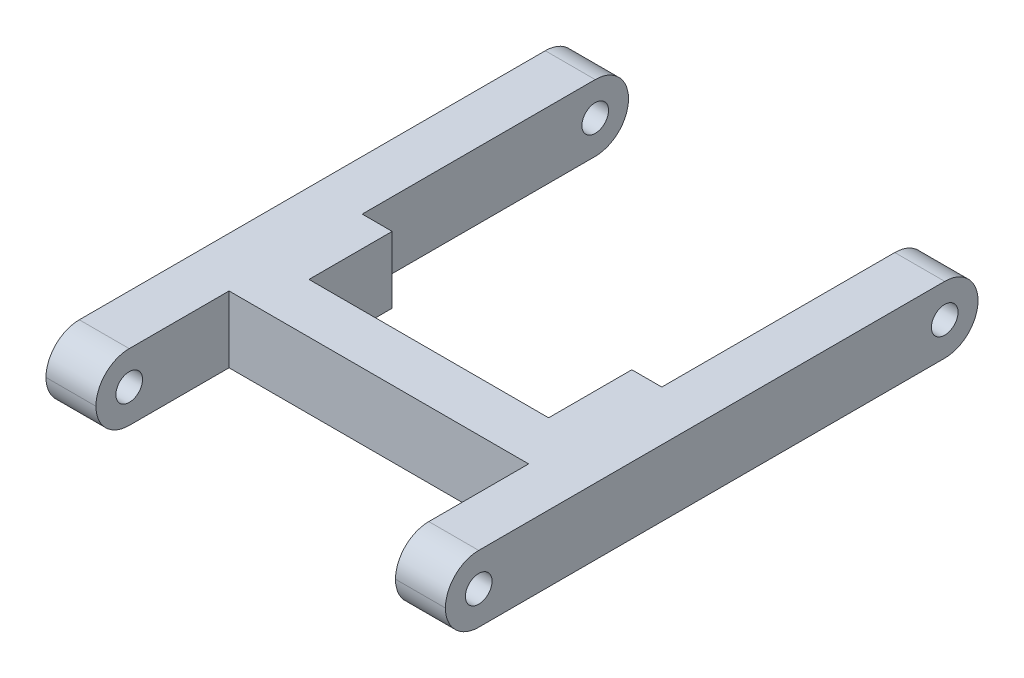
ISO-10303-21;
HEADER;
FILE_DESCRIPTION(('STEP AP214'),'2;1');
FILE_NAME('part.step','',(''),(''),'','','');
FILE_SCHEMA(('AUTOMOTIVE_DESIGN { 1 0 10303 214 1 1 1 1 }'));
ENDSEC;
DATA;
#1=APPLICATION_CONTEXT('core data for automotive mechanical design processes');
#2=APPLICATION_PROTOCOL_DEFINITION('international standard','automotive_design',2000,#1);
#3=PRODUCT_CONTEXT('',#1,'mechanical');
#4=PRODUCT('Part','Part','',(#3));
#5=PRODUCT_RELATED_PRODUCT_CATEGORY('part','',(#4));
#6=PRODUCT_DEFINITION_FORMATION('','',#4);
#7=PRODUCT_DEFINITION_CONTEXT('part definition',#1,'design');
#8=PRODUCT_DEFINITION('design','',#6,#7);
#9=PRODUCT_DEFINITION_SHAPE('','',#8);
#10=(LENGTH_UNIT() NAMED_UNIT(*) SI_UNIT(.MILLI.,.METRE.));
#11=(NAMED_UNIT(*) PLANE_ANGLE_UNIT() SI_UNIT($,.RADIAN.));
#12=(NAMED_UNIT(*) SI_UNIT($,.STERADIAN.) SOLID_ANGLE_UNIT());
#13=UNCERTAINTY_MEASURE_WITH_UNIT(LENGTH_MEASURE(1.E-05),#10,'distance_accuracy_value','');
#14=(GEOMETRIC_REPRESENTATION_CONTEXT(3) GLOBAL_UNCERTAINTY_ASSIGNED_CONTEXT((#13)) GLOBAL_UNIT_ASSIGNED_CONTEXT((#10,
#11,#12)) REPRESENTATION_CONTEXT('',''));
#15=CARTESIAN_POINT('',(0.,0.,0.));
#16=DIRECTION('',(0.,0.,1.));
#17=DIRECTION('',(1.,0.,0.));
#18=AXIS2_PLACEMENT_3D('',#15,#16,#17);
#19=CARTESIAN_POINT('',(0.,10.,0.));
#20=DIRECTION('',(0.,1.,0.));
#21=DIRECTION('',(0.,0.,1.));
#22=AXIS2_PLACEMENT_3D('',#19,#20,#21);
#23=PLANE('',#22);
#24=DIRECTION('',(1.,0.,0.));
#25=VECTOR('',#24,1.);
#26=CARTESIAN_POINT('',(-22.5,10.,0.));
#27=LINE('',#26,#25);
#28=CARTESIAN_POINT('',(18.,10.,0.));
#29=VERTEX_POINT('',#28);
#30=CARTESIAN_POINT('',(22.5,10.,0.));
#31=VERTEX_POINT('',#30);
#32=EDGE_CURVE('E274',#29,#31,#27,.T.);
#33=ORIENTED_EDGE('',*,*,#32,.F.);
#34=DIRECTION('',(0.,0.,1.));
#35=VECTOR('',#34,1.);
#36=CARTESIAN_POINT('',(18.,10.,0.));
#37=LINE('',#36,#35);
#38=CARTESIAN_POINT('',(18.,10.,12.5));
#39=VERTEX_POINT('',#38);
#40=EDGE_CURVE('E226',#29,#39,#37,.T.);
#41=ORIENTED_EDGE('',*,*,#40,.T.);
#42=DIRECTION('',(1.,0.,0.));
#43=VECTOR('',#42,1.);
#44=CARTESIAN_POINT('',(0.,10.,12.5));
#45=LINE('',#44,#43);
#46=CARTESIAN_POINT('',(-18.,10.,12.5));
#47=VERTEX_POINT('',#46);
#48=EDGE_CURVE('E223',#47,#39,#45,.T.);
#49=ORIENTED_EDGE('',*,*,#48,.F.);
#50=DIRECTION('',(0.,0.,1.));
#51=VECTOR('',#50,1.);
#52=CARTESIAN_POINT('',(-18.,10.,0.));
#53=LINE('',#52,#51);
#54=CARTESIAN_POINT('',(-18.,10.,0.));
#55=VERTEX_POINT('',#54);
#56=EDGE_CURVE('E204',#55,#47,#53,.T.);
#57=ORIENTED_EDGE('',*,*,#56,.F.);
#58=CARTESIAN_POINT('',(-22.5,10.,0.));
#59=VERTEX_POINT('',#58);
#60=EDGE_CURVE('E283',#59,#55,#27,.T.);
#61=ORIENTED_EDGE('',*,*,#60,.F.);
#62=DIRECTION('',(0.,0.,1.));
#63=VECTOR('',#62,1.);
#64=CARTESIAN_POINT('',(-22.5,10.,-40.));
#65=LINE('',#64,#63);
#66=CARTESIAN_POINT('',(-22.5,10.,-35.));
#67=VERTEX_POINT('',#66);
#68=EDGE_CURVE('E289',#67,#59,#65,.T.);
#69=ORIENTED_EDGE('',*,*,#68,.F.);
#70=DIRECTION('',(1.,0.,0.));
#71=VECTOR('',#70,1.);
#72=CARTESIAN_POINT('',(0.,10.,-35.));
#73=LINE('',#72,#71);
#74=CARTESIAN_POINT('',(-30.,10.,-35.));
#75=VERTEX_POINT('',#74);
#76=EDGE_CURVE('E361',#67,#75,#73,.F.);
#77=ORIENTED_EDGE('',*,*,#76,.T.);
#78=DIRECTION('',(0.,0.,-1.));
#79=VECTOR('',#78,1.);
#80=CARTESIAN_POINT('',(-30.,10.,40.));
#81=LINE('',#80,#79);
#82=CARTESIAN_POINT('',(-30.,10.,35.));
#83=VERTEX_POINT('',#82);
#84=EDGE_CURVE('E300',#83,#75,#81,.T.);
#85=ORIENTED_EDGE('',*,*,#84,.F.);
#86=DIRECTION('',(1.,0.,0.));
#87=VECTOR('',#86,1.);
#88=CARTESIAN_POINT('',(-22.5,10.,35.));
#89=LINE('',#88,#87);
#90=CARTESIAN_POINT('',(-22.5,10.,35.));
#91=VERTEX_POINT('',#90);
#92=EDGE_CURVE('E359',#83,#91,#89,.T.);
#93=ORIENTED_EDGE('',*,*,#92,.T.);
#94=DIRECTION('',(0.,0.,-1.));
#95=VECTOR('',#94,1.);
#96=CARTESIAN_POINT('',(-22.5,10.,40.));
#97=LINE('',#96,#95);
#98=CARTESIAN_POINT('',(-22.5,10.,20.));
#99=VERTEX_POINT('',#98);
#100=EDGE_CURVE('E259',#91,#99,#97,.T.);
#101=ORIENTED_EDGE('',*,*,#100,.T.);
#102=DIRECTION('',(1.,0.,0.));
#103=VECTOR('',#102,1.);
#104=CARTESIAN_POINT('',(-22.5,10.,20.));
#105=LINE('',#104,#103);
#106=CARTESIAN_POINT('',(22.5,10.,20.));
#107=VERTEX_POINT('',#106);
#108=EDGE_CURVE('E254',#99,#107,#105,.T.);
#109=ORIENTED_EDGE('',*,*,#108,.T.);
#110=DIRECTION('',(0.,0.,-1.));
#111=VECTOR('',#110,1.);
#112=CARTESIAN_POINT('',(22.5,10.,40.));
#113=LINE('',#112,#111);
#114=CARTESIAN_POINT('',(22.5,10.,35.));
#115=VERTEX_POINT('',#114);
#116=EDGE_CURVE('E266',#115,#107,#113,.T.);
#117=ORIENTED_EDGE('',*,*,#116,.F.);
#118=DIRECTION('',(1.,0.,0.));
#119=VECTOR('',#118,1.);
#120=CARTESIAN_POINT('',(30.,10.,35.));
#121=LINE('',#120,#119);
#122=CARTESIAN_POINT('',(30.,10.,35.));
#123=VERTEX_POINT('',#122);
#124=EDGE_CURVE('E357',#115,#123,#121,.T.);
#125=ORIENTED_EDGE('',*,*,#124,.T.);
#126=DIRECTION('',(0.,0.,-1.));
#127=VECTOR('',#126,1.);
#128=CARTESIAN_POINT('',(30.,10.,40.));
#129=LINE('',#128,#127);
#130=CARTESIAN_POINT('',(30.,10.,-35.));
#131=VERTEX_POINT('',#130);
#132=EDGE_CURVE('E297',#123,#131,#129,.T.);
#133=ORIENTED_EDGE('',*,*,#132,.T.);
#134=DIRECTION('',(1.,0.,0.));
#135=VECTOR('',#134,1.);
#136=CARTESIAN_POINT('',(0.,10.,-35.));
#137=LINE('',#136,#135);
#138=CARTESIAN_POINT('',(22.5,10.,-35.));
#139=VERTEX_POINT('',#138);
#140=EDGE_CURVE('E355',#131,#139,#137,.F.);
#141=ORIENTED_EDGE('',*,*,#140,.T.);
#142=DIRECTION('',(0.,0.,1.));
#143=VECTOR('',#142,1.);
#144=CARTESIAN_POINT('',(22.5,10.,-40.));
#145=LINE('',#144,#143);
#146=EDGE_CURVE('E286',#139,#31,#145,.T.);
#147=ORIENTED_EDGE('',*,*,#146,.T.);
#148=EDGE_LOOP('',(#33,#41,#49,#57,#61,#69,#77,#85,#93,#101,#109,#117,#125,#133,#141,#147));
#149=FACE_BOUND('',#148,.T.);
#150=ADVANCED_FACE('F65',(#149),#23,.T.);
#151=CARTESIAN_POINT('',(0.,0.,0.));
#152=DIRECTION('',(0.,1.,0.));
#153=DIRECTION('',(0.,0.,1.));
#154=AXIS2_PLACEMENT_3D('',#151,#152,#153);
#155=PLANE('',#154);
#156=DIRECTION('',(0.,0.,1.));
#157=VECTOR('',#156,1.);
#158=CARTESIAN_POINT('',(18.,0.,0.));
#159=LINE('',#158,#157);
#160=CARTESIAN_POINT('',(18.,0.,0.));
#161=VERTEX_POINT('',#160);
#162=CARTESIAN_POINT('',(18.,0.,12.5));
#163=VERTEX_POINT('',#162);
#164=EDGE_CURVE('E221',#161,#163,#159,.T.);
#165=ORIENTED_EDGE('',*,*,#164,.F.);
#166=DIRECTION('',(1.,0.,0.));
#167=VECTOR('',#166,1.);
#168=CARTESIAN_POINT('',(-22.5,0.,0.));
#169=LINE('',#168,#167);
#170=CARTESIAN_POINT('',(22.5,0.,0.));
#171=VERTEX_POINT('',#170);
#172=EDGE_CURVE('E277',#161,#171,#169,.T.);
#173=ORIENTED_EDGE('',*,*,#172,.T.);
#174=DIRECTION('',(0.,0.,1.));
#175=VECTOR('',#174,1.);
#176=CARTESIAN_POINT('',(22.5,0.,-40.));
#177=LINE('',#176,#175);
#178=CARTESIAN_POINT('',(22.5,0.,-35.));
#179=VERTEX_POINT('',#178);
#180=EDGE_CURVE('E276',#179,#171,#177,.T.);
#181=ORIENTED_EDGE('',*,*,#180,.F.);
#182=DIRECTION('',(1.,0.,0.));
#183=VECTOR('',#182,1.);
#184=CARTESIAN_POINT('',(30.,0.,-35.));
#185=LINE('',#184,#183);
#186=CARTESIAN_POINT('',(30.,0.,-35.));
#187=VERTEX_POINT('',#186);
#188=EDGE_CURVE('E320',#179,#187,#185,.T.);
#189=ORIENTED_EDGE('',*,*,#188,.T.);
#190=DIRECTION('',(0.,0.,-1.));
#191=VECTOR('',#190,1.);
#192=CARTESIAN_POINT('',(30.,0.,40.));
#193=LINE('',#192,#191);
#194=CARTESIAN_POINT('',(30.,0.,35.));
#195=VERTEX_POINT('',#194);
#196=EDGE_CURVE('E294',#195,#187,#193,.T.);
#197=ORIENTED_EDGE('',*,*,#196,.F.);
#198=DIRECTION('',(1.,0.,0.));
#199=VECTOR('',#198,1.);
#200=CARTESIAN_POINT('',(0.,0.,35.));
#201=LINE('',#200,#199);
#202=CARTESIAN_POINT('',(22.5,0.,35.));
#203=VERTEX_POINT('',#202);
#204=EDGE_CURVE('E329',#195,#203,#201,.F.);
#205=ORIENTED_EDGE('',*,*,#204,.T.);
#206=DIRECTION('',(0.,0.,-1.));
#207=VECTOR('',#206,1.);
#208=CARTESIAN_POINT('',(22.5,0.,40.));
#209=LINE('',#208,#207);
#210=CARTESIAN_POINT('',(22.5,0.,20.));
#211=VERTEX_POINT('',#210);
#212=EDGE_CURVE('E258',#203,#211,#209,.T.);
#213=ORIENTED_EDGE('',*,*,#212,.T.);
#214=DIRECTION('',(1.,0.,0.));
#215=VECTOR('',#214,1.);
#216=CARTESIAN_POINT('',(-22.5,0.,20.));
#217=LINE('',#216,#215);
#218=CARTESIAN_POINT('',(-22.5,0.,20.));
#219=VERTEX_POINT('',#218);
#220=EDGE_CURVE('E255',#219,#211,#217,.T.);
#221=ORIENTED_EDGE('',*,*,#220,.F.);
#222=DIRECTION('',(0.,0.,-1.));
#223=VECTOR('',#222,1.);
#224=CARTESIAN_POINT('',(-22.5,0.,40.));
#225=LINE('',#224,#223);
#226=CARTESIAN_POINT('',(-22.5,0.,35.));
#227=VERTEX_POINT('',#226);
#228=EDGE_CURVE('E261',#227,#219,#225,.T.);
#229=ORIENTED_EDGE('',*,*,#228,.F.);
#230=DIRECTION('',(1.,0.,0.));
#231=VECTOR('',#230,1.);
#232=CARTESIAN_POINT('',(0.,0.,35.));
#233=LINE('',#232,#231);
#234=CARTESIAN_POINT('',(-30.,0.,35.));
#235=VERTEX_POINT('',#234);
#236=EDGE_CURVE('E326',#227,#235,#233,.F.);
#237=ORIENTED_EDGE('',*,*,#236,.T.);
#238=DIRECTION('',(0.,0.,-1.));
#239=VECTOR('',#238,1.);
#240=CARTESIAN_POINT('',(-30.,0.,40.));
#241=LINE('',#240,#239);
#242=CARTESIAN_POINT('',(-30.,0.,-35.));
#243=VERTEX_POINT('',#242);
#244=EDGE_CURVE('E301',#235,#243,#241,.T.);
#245=ORIENTED_EDGE('',*,*,#244,.T.);
#246=DIRECTION('',(1.,0.,0.));
#247=VECTOR('',#246,1.);
#248=CARTESIAN_POINT('',(-22.5,0.,-35.));
#249=LINE('',#248,#247);
#250=CARTESIAN_POINT('',(-22.5,0.,-35.));
#251=VERTEX_POINT('',#250);
#252=EDGE_CURVE('E323',#243,#251,#249,.T.);
#253=ORIENTED_EDGE('',*,*,#252,.T.);
#254=DIRECTION('',(0.,0.,1.));
#255=VECTOR('',#254,1.);
#256=CARTESIAN_POINT('',(-22.5,0.,-40.));
#257=LINE('',#256,#255);
#258=CARTESIAN_POINT('',(-22.5,0.,0.));
#259=VERTEX_POINT('',#258);
#260=EDGE_CURVE('E280',#251,#259,#257,.T.);
#261=ORIENTED_EDGE('',*,*,#260,.T.);
#262=CARTESIAN_POINT('',(-18.,0.,0.));
#263=VERTEX_POINT('',#262);
#264=EDGE_CURVE('E220',#259,#263,#169,.T.);
#265=ORIENTED_EDGE('',*,*,#264,.T.);
#266=DIRECTION('',(0.,0.,1.));
#267=VECTOR('',#266,1.);
#268=CARTESIAN_POINT('',(-18.,0.,0.));
#269=LINE('',#268,#267);
#270=CARTESIAN_POINT('',(-18.,0.,12.5));
#271=VERTEX_POINT('',#270);
#272=EDGE_CURVE('E80',#263,#271,#269,.T.);
#273=ORIENTED_EDGE('',*,*,#272,.T.);
#274=DIRECTION('',(1.,0.,0.));
#275=VECTOR('',#274,1.);
#276=CARTESIAN_POINT('',(0.,0.,12.5));
#277=LINE('',#276,#275);
#278=EDGE_CURVE('E209',#271,#163,#277,.T.);
#279=ORIENTED_EDGE('',*,*,#278,.T.);
#280=EDGE_LOOP('',(#165,#173,#181,#189,#197,#205,#213,#221,#229,#237,#245,#253,#261,#265,#273,#279));
#281=FACE_BOUND('',#280,.T.);
#282=ADVANCED_FACE('F218',(#281),#155,.F.);
#283=CARTESIAN_POINT('',(-22.5,0.,0.));
#284=DIRECTION('',(0.,0.,1.));
#285=DIRECTION('',(1.,0.,0.));
#286=AXIS2_PLACEMENT_3D('',#283,#284,#285);
#287=PLANE('',#286);
#288=DIRECTION('',(0.,-1.,0.));
#289=VECTOR('',#288,1.);
#290=CARTESIAN_POINT('',(18.,0.,0.));
#291=LINE('',#290,#289);
#292=EDGE_CURVE('E12',#29,#161,#291,.T.);
#293=ORIENTED_EDGE('',*,*,#292,.F.);
#294=ORIENTED_EDGE('',*,*,#32,.T.);
#295=DIRECTION('',(0.,1.,0.));
#296=VECTOR('',#295,1.);
#297=CARTESIAN_POINT('',(22.5,0.,0.));
#298=LINE('',#297,#296);
#299=EDGE_CURVE('E282',#171,#31,#298,.T.);
#300=ORIENTED_EDGE('',*,*,#299,.F.);
#301=ORIENTED_EDGE('',*,*,#172,.F.);
#302=EDGE_LOOP('',(#293,#294,#300,#301));
#303=FACE_BOUND('',#302,.T.);
#304=ADVANCED_FACE('F383',(#303),#287,.F.);
#305=CARTESIAN_POINT('',(-30.,10.,40.));
#306=DIRECTION('',(-1.,0.,0.));
#307=DIRECTION('',(0.,0.,1.));
#308=AXIS2_PLACEMENT_3D('',#305,#306,#307);
#309=PLANE('',#308);
#310=CARTESIAN_POINT('',(-30.,5.,-35.));
#311=DIRECTION('',(-1.,0.,0.));
#312=DIRECTION('',(0.,0.,1.));
#313=AXIS2_PLACEMENT_3D('',#310,#311,#312);
#314=CIRCLE('',#313,5.);
#315=CARTESIAN_POINT('',(-30.,5.,-40.));
#316=VERTEX_POINT('',#315);
#317=EDGE_CURVE('E344',#75,#316,#314,.T.);
#318=ORIENTED_EDGE('',*,*,#317,.T.);
#319=CARTESIAN_POINT('',(-30.,5.,-35.));
#320=DIRECTION('',(-1.,0.,0.));
#321=DIRECTION('',(0.,0.,1.));
#322=AXIS2_PLACEMENT_3D('',#319,#320,#321);
#323=CIRCLE('',#322,5.);
#324=EDGE_CURVE('E346',#316,#243,#323,.T.);
#325=ORIENTED_EDGE('',*,*,#324,.T.);
#326=ORIENTED_EDGE('',*,*,#244,.F.);
#327=CARTESIAN_POINT('',(-30.,5.,35.));
#328=DIRECTION('',(-1.,0.,0.));
#329=DIRECTION('',(0.,0.,1.));
#330=AXIS2_PLACEMENT_3D('',#327,#328,#329);
#331=CIRCLE('',#330,5.);
#332=CARTESIAN_POINT('',(-30.,5.,40.));
#333=VERTEX_POINT('',#332);
#334=EDGE_CURVE('E342',#235,#333,#331,.T.);
#335=ORIENTED_EDGE('',*,*,#334,.T.);
#336=CARTESIAN_POINT('',(-30.,5.,35.));
#337=DIRECTION('',(-1.,0.,0.));
#338=DIRECTION('',(0.,0.,1.));
#339=AXIS2_PLACEMENT_3D('',#336,#337,#338);
#340=CIRCLE('',#339,5.);
#341=EDGE_CURVE('E340',#333,#83,#340,.T.);
#342=ORIENTED_EDGE('',*,*,#341,.T.);
#343=ORIENTED_EDGE('',*,*,#84,.T.);
#344=EDGE_LOOP('',(#318,#325,#326,#335,#342,#343));
#345=FACE_BOUND('',#344,.T.);
#346=CARTESIAN_POINT('',(-30.,5.,-35.));
#347=DIRECTION('',(-1.,0.,0.));
#348=DIRECTION('',(0.,0.,1.));
#349=AXIS2_PLACEMENT_3D('',#346,#347,#348);
#350=CIRCLE('',#349,2.00000000000012);
#351=CARTESIAN_POINT('',(-30.,5.,-32.9999999999999));
#352=VERTEX_POINT('',#351);
#353=EDGE_CURVE('E240',#352,#352,#350,.T.);
#354=ORIENTED_EDGE('',*,*,#353,.F.);
#355=EDGE_LOOP('',(#354));
#356=FACE_BOUND('',#355,.T.);
#357=CARTESIAN_POINT('',(-30.,4.99999999999995,34.9999999999999));
#358=DIRECTION('',(-1.,0.,0.));
#359=DIRECTION('',(0.,0.,1.));
#360=AXIS2_PLACEMENT_3D('',#357,#358,#359);
#361=CIRCLE('',#360,1.99999999999999);
#362=CARTESIAN_POINT('',(-30.,4.99999999999995,36.9999999999999));
#363=VERTEX_POINT('',#362);
#364=EDGE_CURVE('E237',#363,#363,#361,.F.);
#365=ORIENTED_EDGE('',*,*,#364,.T.);
#366=EDGE_LOOP('',(#365));
#367=FACE_BOUND('',#366,.T.);
#368=ADVANCED_FACE('F430',(#345,#356,#367),#309,.T.);
#369=CARTESIAN_POINT('',(30.,10.,40.));
#370=DIRECTION('',(-1.,0.,0.));
#371=DIRECTION('',(0.,0.,1.));
#372=AXIS2_PLACEMENT_3D('',#369,#370,#371);
#373=PLANE('',#372);
#374=CARTESIAN_POINT('',(30.,5.,-35.));
#375=DIRECTION('',(-1.,0.,0.));
#376=DIRECTION('',(0.,0.,1.));
#377=AXIS2_PLACEMENT_3D('',#374,#375,#376);
#378=CIRCLE('',#377,2.00000000000012);
#379=CARTESIAN_POINT('',(30.,5.,-32.9999999999999));
#380=VERTEX_POINT('',#379);
#381=EDGE_CURVE('E243',#380,#380,#378,.T.);
#382=ORIENTED_EDGE('',*,*,#381,.T.);
#383=EDGE_LOOP('',(#382));
#384=FACE_BOUND('',#383,.T.);
#385=CARTESIAN_POINT('',(30.,5.,35.));
#386=DIRECTION('',(-1.,0.,0.));
#387=DIRECTION('',(0.,0.,1.));
#388=AXIS2_PLACEMENT_3D('',#385,#386,#387);
#389=CIRCLE('',#388,5.);
#390=CARTESIAN_POINT('',(30.,5.,40.));
#391=VERTEX_POINT('',#390);
#392=EDGE_CURVE('E316',#123,#391,#389,.F.);
#393=ORIENTED_EDGE('',*,*,#392,.T.);
#394=CARTESIAN_POINT('',(30.,5.,35.));
#395=DIRECTION('',(-1.,0.,0.));
#396=DIRECTION('',(0.,0.,1.));
#397=AXIS2_PLACEMENT_3D('',#394,#395,#396);
#398=CIRCLE('',#397,5.);
#399=EDGE_CURVE('E318',#391,#195,#398,.F.);
#400=ORIENTED_EDGE('',*,*,#399,.T.);
#401=ORIENTED_EDGE('',*,*,#196,.T.);
#402=CARTESIAN_POINT('',(30.,5.,-35.));
#403=DIRECTION('',(-1.,0.,0.));
#404=DIRECTION('',(0.,0.,1.));
#405=AXIS2_PLACEMENT_3D('',#402,#403,#404);
#406=CIRCLE('',#405,5.);
#407=CARTESIAN_POINT('',(30.,5.,-40.));
#408=VERTEX_POINT('',#407);
#409=EDGE_CURVE('E314',#187,#408,#406,.F.);
#410=ORIENTED_EDGE('',*,*,#409,.T.);
#411=CARTESIAN_POINT('',(30.,5.,-35.));
#412=DIRECTION('',(-1.,0.,0.));
#413=DIRECTION('',(0.,0.,1.));
#414=AXIS2_PLACEMENT_3D('',#411,#412,#413);
#415=CIRCLE('',#414,5.);
#416=EDGE_CURVE('E304',#408,#131,#415,.F.);
#417=ORIENTED_EDGE('',*,*,#416,.T.);
#418=ORIENTED_EDGE('',*,*,#132,.F.);
#419=EDGE_LOOP('',(#393,#400,#401,#410,#417,#418));
#420=FACE_BOUND('',#419,.T.);
#421=CARTESIAN_POINT('',(30.,4.99999999999995,34.9999999999999));
#422=DIRECTION('',(-1.,0.,0.));
#423=DIRECTION('',(0.,0.,1.));
#424=AXIS2_PLACEMENT_3D('',#421,#422,#423);
#425=CIRCLE('',#424,1.99999999999999);
#426=CARTESIAN_POINT('',(30.,4.99999999999995,36.9999999999999));
#427=VERTEX_POINT('',#426);
#428=EDGE_CURVE('E233',#427,#427,#425,.F.);
#429=ORIENTED_EDGE('',*,*,#428,.F.);
#430=EDGE_LOOP('',(#429));
#431=FACE_BOUND('',#430,.T.);
#432=ADVANCED_FACE('F394',(#384,#420,#431),#373,.F.);
#433=ORIENTED_EDGE('',*,*,#60,.T.);
#434=DIRECTION('',(0.,-1.,0.));
#435=VECTOR('',#434,1.);
#436=CARTESIAN_POINT('',(-18.,0.,0.));
#437=LINE('',#436,#435);
#438=EDGE_CURVE('E73',#55,#263,#437,.T.);
#439=ORIENTED_EDGE('',*,*,#438,.T.);
#440=ORIENTED_EDGE('',*,*,#264,.F.);
#441=DIRECTION('',(0.,1.,0.));
#442=VECTOR('',#441,1.);
#443=CARTESIAN_POINT('',(-22.5,0.,0.));
#444=LINE('',#443,#442);
#445=EDGE_CURVE('E291',#259,#59,#444,.T.);
#446=ORIENTED_EDGE('',*,*,#445,.T.);
#447=EDGE_LOOP('',(#433,#439,#440,#446));
#448=FACE_BOUND('',#447,.T.);
#449=ADVANCED_FACE('F373',(#448),#287,.F.);
#450=CARTESIAN_POINT('',(-22.5,0.,-40.));
#451=DIRECTION('',(-1.,0.,0.));
#452=DIRECTION('',(0.,0.,1.));
#453=AXIS2_PLACEMENT_3D('',#450,#451,#452);
#454=PLANE('',#453);
#455=CARTESIAN_POINT('',(-22.5,5.,-35.));
#456=DIRECTION('',(-1.,0.,0.));
#457=DIRECTION('',(0.,0.,1.));
#458=AXIS2_PLACEMENT_3D('',#455,#456,#457);
#459=CIRCLE('',#458,2.00000000000012);
#460=CARTESIAN_POINT('',(-22.5,5.,-32.9999999999999));
#461=VERTEX_POINT('',#460);
#462=EDGE_CURVE('E251',#461,#461,#459,.T.);
#463=ORIENTED_EDGE('',*,*,#462,.T.);
#464=EDGE_LOOP('',(#463));
#465=FACE_BOUND('',#464,.T.);
#466=ORIENTED_EDGE('',*,*,#260,.F.);
#467=CARTESIAN_POINT('',(-22.5,5.,-35.));
#468=DIRECTION('',(-1.,0.,0.));
#469=DIRECTION('',(0.,0.,1.));
#470=AXIS2_PLACEMENT_3D('',#467,#468,#469);
#471=CIRCLE('',#470,5.);
#472=CARTESIAN_POINT('',(-22.5,5.,-40.));
#473=VERTEX_POINT('',#472);
#474=EDGE_CURVE('E350',#251,#473,#471,.F.);
#475=ORIENTED_EDGE('',*,*,#474,.T.);
#476=CARTESIAN_POINT('',(-22.5,5.,-35.));
#477=DIRECTION('',(-1.,0.,0.));
#478=DIRECTION('',(0.,0.,1.));
#479=AXIS2_PLACEMENT_3D('',#476,#477,#478);
#480=CIRCLE('',#479,5.);
#481=EDGE_CURVE('E348',#473,#67,#480,.F.);
#482=ORIENTED_EDGE('',*,*,#481,.T.);
#483=ORIENTED_EDGE('',*,*,#68,.T.);
#484=ORIENTED_EDGE('',*,*,#445,.F.);
#485=EDGE_LOOP('',(#466,#475,#482,#483,#484));
#486=FACE_BOUND('',#485,.T.);
#487=ADVANCED_FACE('F490',(#465,#486),#454,.F.);
#488=CARTESIAN_POINT('',(22.5,0.,-40.));
#489=DIRECTION('',(-1.,0.,0.));
#490=DIRECTION('',(0.,0.,1.));
#491=AXIS2_PLACEMENT_3D('',#488,#489,#490);
#492=PLANE('',#491);
#493=CARTESIAN_POINT('',(22.5,5.,-35.));
#494=DIRECTION('',(-1.,0.,0.));
#495=DIRECTION('',(0.,0.,1.));
#496=AXIS2_PLACEMENT_3D('',#493,#494,#495);
#497=CIRCLE('',#496,2.00000000000012);
#498=CARTESIAN_POINT('',(22.5,5.,-32.9999999999999));
#499=VERTEX_POINT('',#498);
#500=EDGE_CURVE('E250',#499,#499,#497,.T.);
#501=ORIENTED_EDGE('',*,*,#500,.F.);
#502=EDGE_LOOP('',(#501));
#503=FACE_BOUND('',#502,.T.);
#504=CARTESIAN_POINT('',(22.5,5.,-35.));
#505=DIRECTION('',(-1.,0.,0.));
#506=DIRECTION('',(0.,0.,1.));
#507=AXIS2_PLACEMENT_3D('',#504,#505,#506);
#508=CIRCLE('',#507,5.);
#509=CARTESIAN_POINT('',(22.5,5.,-40.));
#510=VERTEX_POINT('',#509);
#511=EDGE_CURVE('E88',#139,#510,#508,.T.);
#512=ORIENTED_EDGE('',*,*,#511,.T.);
#513=CARTESIAN_POINT('',(22.5,5.,-35.));
#514=DIRECTION('',(-1.,0.,0.));
#515=DIRECTION('',(0.,0.,1.));
#516=AXIS2_PLACEMENT_3D('',#513,#514,#515);
#517=CIRCLE('',#516,5.);
#518=EDGE_CURVE('E353',#510,#179,#517,.T.);
#519=ORIENTED_EDGE('',*,*,#518,.T.);
#520=ORIENTED_EDGE('',*,*,#180,.T.);
#521=ORIENTED_EDGE('',*,*,#299,.T.);
#522=ORIENTED_EDGE('',*,*,#146,.F.);
#523=EDGE_LOOP('',(#512,#519,#520,#521,#522));
#524=FACE_BOUND('',#523,.T.);
#525=ADVANCED_FACE('F387',(#503,#524),#492,.T.);
#526=CARTESIAN_POINT('',(-22.5,0.,20.));
#527=DIRECTION('',(0.,0.,1.));
#528=DIRECTION('',(1.,0.,0.));
#529=AXIS2_PLACEMENT_3D('',#526,#527,#528);
#530=PLANE('',#529);
#531=ORIENTED_EDGE('',*,*,#108,.F.);
#532=DIRECTION('',(0.,1.,0.));
#533=VECTOR('',#532,1.);
#534=CARTESIAN_POINT('',(-22.5,0.,20.));
#535=LINE('',#534,#533);
#536=EDGE_CURVE('E263',#219,#99,#535,.T.);
#537=ORIENTED_EDGE('',*,*,#536,.F.);
#538=ORIENTED_EDGE('',*,*,#220,.T.);
#539=DIRECTION('',(0.,1.,0.));
#540=VECTOR('',#539,1.);
#541=CARTESIAN_POINT('',(22.5,0.,20.));
#542=LINE('',#541,#540);
#543=EDGE_CURVE('E271',#211,#107,#542,.T.);
#544=ORIENTED_EDGE('',*,*,#543,.T.);
#545=EDGE_LOOP('',(#531,#537,#538,#544));
#546=FACE_BOUND('',#545,.T.);
#547=ADVANCED_FACE('F412',(#546),#530,.T.);
#548=CARTESIAN_POINT('',(22.5,0.,40.));
#549=DIRECTION('',(1.,0.,0.));
#550=DIRECTION('',(0.,0.,-1.));
#551=AXIS2_PLACEMENT_3D('',#548,#549,#550);
#552=PLANE('',#551);
#553=CARTESIAN_POINT('',(22.5,4.99999999999995,34.9999999999999));
#554=DIRECTION('',(1.,0.,0.));
#555=DIRECTION('',(0.,0.,-1.));
#556=AXIS2_PLACEMENT_3D('',#553,#554,#555);
#557=CIRCLE('',#556,1.99999999999999);
#558=CARTESIAN_POINT('',(22.5,4.99999999999995,32.9999999999999));
#559=VERTEX_POINT('',#558);
#560=EDGE_CURVE('E247',#559,#559,#557,.F.);
#561=ORIENTED_EDGE('',*,*,#560,.F.);
#562=EDGE_LOOP('',(#561));
#563=FACE_BOUND('',#562,.T.);
#564=ORIENTED_EDGE('',*,*,#212,.F.);
#565=CARTESIAN_POINT('',(22.5,5.,35.));
#566=DIRECTION('',(1.,0.,0.));
#567=DIRECTION('',(0.,0.,-1.));
#568=AXIS2_PLACEMENT_3D('',#565,#566,#567);
#569=CIRCLE('',#568,5.);
#570=CARTESIAN_POINT('',(22.5,5.,40.));
#571=VERTEX_POINT('',#570);
#572=EDGE_CURVE('E334',#203,#571,#569,.F.);
#573=ORIENTED_EDGE('',*,*,#572,.T.);
#574=CARTESIAN_POINT('',(22.5,5.,35.));
#575=DIRECTION('',(1.,0.,0.));
#576=DIRECTION('',(0.,0.,-1.));
#577=AXIS2_PLACEMENT_3D('',#574,#575,#576);
#578=CIRCLE('',#577,5.);
#579=EDGE_CURVE('E332',#571,#115,#578,.F.);
#580=ORIENTED_EDGE('',*,*,#579,.T.);
#581=ORIENTED_EDGE('',*,*,#116,.T.);
#582=ORIENTED_EDGE('',*,*,#543,.F.);
#583=EDGE_LOOP('',(#564,#573,#580,#581,#582));
#584=FACE_BOUND('',#583,.T.);
#585=ADVANCED_FACE('F407',(#563,#584),#552,.F.);
#586=CARTESIAN_POINT('',(-22.5,0.,40.));
#587=DIRECTION('',(1.,0.,0.));
#588=DIRECTION('',(0.,0.,-1.));
#589=AXIS2_PLACEMENT_3D('',#586,#587,#588);
#590=PLANE('',#589);
#591=CARTESIAN_POINT('',(-22.5,4.99999999999995,34.9999999999999));
#592=DIRECTION('',(1.,0.,0.));
#593=DIRECTION('',(0.,0.,-1.));
#594=AXIS2_PLACEMENT_3D('',#591,#592,#593);
#595=CIRCLE('',#594,1.99999999999999);
#596=CARTESIAN_POINT('',(-22.5,4.99999999999995,32.9999999999999));
#597=VERTEX_POINT('',#596);
#598=EDGE_CURVE('E236',#597,#597,#595,.F.);
#599=ORIENTED_EDGE('',*,*,#598,.T.);
#600=EDGE_LOOP('',(#599));
#601=FACE_BOUND('',#600,.T.);
#602=CARTESIAN_POINT('',(-22.5,5.,35.));
#603=DIRECTION('',(1.,0.,0.));
#604=DIRECTION('',(0.,0.,-1.));
#605=AXIS2_PLACEMENT_3D('',#602,#603,#604);
#606=CIRCLE('',#605,5.);
#607=CARTESIAN_POINT('',(-22.5,5.,40.));
#608=VERTEX_POINT('',#607);
#609=EDGE_CURVE('E336',#91,#608,#606,.T.);
#610=ORIENTED_EDGE('',*,*,#609,.T.);
#611=CARTESIAN_POINT('',(-22.5,5.,35.));
#612=DIRECTION('',(1.,0.,0.));
#613=DIRECTION('',(0.,0.,-1.));
#614=AXIS2_PLACEMENT_3D('',#611,#612,#613);
#615=CIRCLE('',#614,5.);
#616=EDGE_CURVE('E338',#608,#227,#615,.T.);
#617=ORIENTED_EDGE('',*,*,#616,.T.);
#618=ORIENTED_EDGE('',*,*,#228,.T.);
#619=ORIENTED_EDGE('',*,*,#536,.T.);
#620=ORIENTED_EDGE('',*,*,#100,.F.);
#621=EDGE_LOOP('',(#610,#617,#618,#619,#620));
#622=FACE_BOUND('',#621,.T.);
#623=ADVANCED_FACE('F420',(#601,#622),#590,.T.);
#624=CARTESIAN_POINT('',(30.,4.99999999999995,34.9999999999999));
#625=DIRECTION('',(-1.,0.,0.));
#626=DIRECTION('',(0.,0.,1.));
#627=AXIS2_PLACEMENT_3D('',#624,#625,#626);
#628=CYLINDRICAL_SURFACE('',#627,1.99999999999999);
#629=ORIENTED_EDGE('',*,*,#598,.F.);
#630=EDGE_LOOP('',(#629));
#631=FACE_BOUND('',#630,.T.);
#632=ORIENTED_EDGE('',*,*,#364,.F.);
#633=EDGE_LOOP('',(#632));
#634=FACE_BOUND('',#633,.T.);
#635=ADVANCED_FACE('F507',(#631,#634),#628,.F.);
#636=ORIENTED_EDGE('',*,*,#428,.T.);
#637=EDGE_LOOP('',(#636));
#638=FACE_BOUND('',#637,.T.);
#639=ORIENTED_EDGE('',*,*,#560,.T.);
#640=EDGE_LOOP('',(#639));
#641=FACE_BOUND('',#640,.T.);
#642=ADVANCED_FACE('F511',(#638,#641),#628,.F.);
#643=CARTESIAN_POINT('',(30.,5.,-35.));
#644=DIRECTION('',(-1.,0.,0.));
#645=DIRECTION('',(0.,0.,1.));
#646=AXIS2_PLACEMENT_3D('',#643,#644,#645);
#647=CYLINDRICAL_SURFACE('',#646,2.00000000000012);
#648=ORIENTED_EDGE('',*,*,#500,.T.);
#649=EDGE_LOOP('',(#648));
#650=FACE_BOUND('',#649,.T.);
#651=ORIENTED_EDGE('',*,*,#381,.F.);
#652=EDGE_LOOP('',(#651));
#653=FACE_BOUND('',#652,.T.);
#654=ADVANCED_FACE('F467',(#650,#653),#647,.F.);
#655=ORIENTED_EDGE('',*,*,#353,.T.);
#656=EDGE_LOOP('',(#655));
#657=FACE_BOUND('',#656,.T.);
#658=ORIENTED_EDGE('',*,*,#462,.F.);
#659=EDGE_LOOP('',(#658));
#660=FACE_BOUND('',#659,.T.);
#661=ADVANCED_FACE('F461',(#657,#660),#647,.F.);
#662=CARTESIAN_POINT('',(0.,5.,35.));
#663=DIRECTION('',(-1.,0.,0.));
#664=DIRECTION('',(0.,0.,1.));
#665=AXIS2_PLACEMENT_3D('',#662,#663,#664);
#666=CYLINDRICAL_SURFACE('',#665,5.);
#667=ORIENTED_EDGE('',*,*,#124,.F.);
#668=ORIENTED_EDGE('',*,*,#579,.F.);
#669=DIRECTION('',(1.,0.,0.));
#670=VECTOR('',#669,1.);
#671=CARTESIAN_POINT('',(22.5,5.,40.));
#672=LINE('',#671,#670);
#673=EDGE_CURVE('E246',#391,#571,#672,.F.);
#674=ORIENTED_EDGE('',*,*,#673,.F.);
#675=ORIENTED_EDGE('',*,*,#392,.F.);
#676=EDGE_LOOP('',(#667,#668,#674,#675));
#677=FACE_BOUND('',#676,.T.);
#678=ADVANCED_FACE('F442',(#677),#666,.T.);
#679=CARTESIAN_POINT('',(-30.,5.,35.));
#680=DIRECTION('',(1.,0.,0.));
#681=DIRECTION('',(0.,0.,-1.));
#682=AXIS2_PLACEMENT_3D('',#679,#680,#681);
#683=CYLINDRICAL_SURFACE('',#682,5.);
#684=ORIENTED_EDGE('',*,*,#572,.F.);
#685=ORIENTED_EDGE('',*,*,#204,.F.);
#686=ORIENTED_EDGE('',*,*,#399,.F.);
#687=ORIENTED_EDGE('',*,*,#673,.T.);
#688=EDGE_LOOP('',(#684,#685,#686,#687));
#689=FACE_BOUND('',#688,.T.);
#690=ADVANCED_FACE('F402',(#689),#683,.T.);
#691=CARTESIAN_POINT('',(0.,5.,35.));
#692=DIRECTION('',(-1.,0.,0.));
#693=DIRECTION('',(0.,0.,1.));
#694=AXIS2_PLACEMENT_3D('',#691,#692,#693);
#695=CYLINDRICAL_SURFACE('',#694,5.);
#696=ORIENTED_EDGE('',*,*,#92,.F.);
#697=ORIENTED_EDGE('',*,*,#341,.F.);
#698=DIRECTION('',(1.,0.,0.));
#699=VECTOR('',#698,1.);
#700=CARTESIAN_POINT('',(-30.,5.,40.));
#701=LINE('',#700,#699);
#702=EDGE_CURVE('E365',#608,#333,#701,.F.);
#703=ORIENTED_EDGE('',*,*,#702,.F.);
#704=ORIENTED_EDGE('',*,*,#609,.F.);
#705=EDGE_LOOP('',(#696,#697,#703,#704));
#706=FACE_BOUND('',#705,.T.);
#707=ADVANCED_FACE('F433',(#706),#695,.T.);
#708=CARTESIAN_POINT('',(-30.,5.,35.));
#709=DIRECTION('',(1.,0.,0.));
#710=DIRECTION('',(0.,0.,-1.));
#711=AXIS2_PLACEMENT_3D('',#708,#709,#710);
#712=CYLINDRICAL_SURFACE('',#711,5.);
#713=ORIENTED_EDGE('',*,*,#334,.F.);
#714=ORIENTED_EDGE('',*,*,#236,.F.);
#715=ORIENTED_EDGE('',*,*,#616,.F.);
#716=ORIENTED_EDGE('',*,*,#702,.T.);
#717=EDGE_LOOP('',(#713,#714,#715,#716));
#718=FACE_BOUND('',#717,.T.);
#719=ADVANCED_FACE('F426',(#718),#712,.T.);
#720=CARTESIAN_POINT('',(-30.,5.,-35.));
#721=DIRECTION('',(1.,0.,0.));
#722=DIRECTION('',(0.,0.,-1.));
#723=AXIS2_PLACEMENT_3D('',#720,#721,#722);
#724=CYLINDRICAL_SURFACE('',#723,5.);
#725=DIRECTION('',(1.,0.,0.));
#726=VECTOR('',#725,1.);
#727=CARTESIAN_POINT('',(-30.,5.,-40.));
#728=LINE('',#727,#726);
#729=EDGE_CURVE('E368',#316,#473,#728,.T.);
#730=ORIENTED_EDGE('',*,*,#729,.F.);
#731=ORIENTED_EDGE('',*,*,#317,.F.);
#732=ORIENTED_EDGE('',*,*,#76,.F.);
#733=ORIENTED_EDGE('',*,*,#481,.F.);
#734=EDGE_LOOP('',(#730,#731,#732,#733));
#735=FACE_BOUND('',#734,.T.);
#736=ADVANCED_FACE('F440',(#735),#724,.T.);
#737=CARTESIAN_POINT('',(0.,5.,-35.));
#738=DIRECTION('',(-1.,0.,0.));
#739=DIRECTION('',(0.,0.,1.));
#740=AXIS2_PLACEMENT_3D('',#737,#738,#739);
#741=CYLINDRICAL_SURFACE('',#740,5.);
#742=ORIENTED_EDGE('',*,*,#324,.F.);
#743=ORIENTED_EDGE('',*,*,#729,.T.);
#744=ORIENTED_EDGE('',*,*,#474,.F.);
#745=ORIENTED_EDGE('',*,*,#252,.F.);
#746=EDGE_LOOP('',(#742,#743,#744,#745));
#747=FACE_BOUND('',#746,.T.);
#748=ADVANCED_FACE('F473',(#747),#741,.T.);
#749=CARTESIAN_POINT('',(-30.,5.,-35.));
#750=DIRECTION('',(1.,0.,0.));
#751=DIRECTION('',(0.,0.,-1.));
#752=AXIS2_PLACEMENT_3D('',#749,#750,#751);
#753=CYLINDRICAL_SURFACE('',#752,5.);
#754=DIRECTION('',(1.,0.,0.));
#755=VECTOR('',#754,1.);
#756=CARTESIAN_POINT('',(-30.,5.,-40.));
#757=LINE('',#756,#755);
#758=EDGE_CURVE('E231',#510,#408,#757,.T.);
#759=ORIENTED_EDGE('',*,*,#758,.F.);
#760=ORIENTED_EDGE('',*,*,#511,.F.);
#761=ORIENTED_EDGE('',*,*,#140,.F.);
#762=ORIENTED_EDGE('',*,*,#416,.F.);
#763=EDGE_LOOP('',(#759,#760,#761,#762));
#764=FACE_BOUND('',#763,.T.);
#765=ADVANCED_FACE('F67',(#764),#753,.T.);
#766=CARTESIAN_POINT('',(0.,5.,-35.));
#767=DIRECTION('',(-1.,0.,0.));
#768=DIRECTION('',(0.,0.,1.));
#769=AXIS2_PLACEMENT_3D('',#766,#767,#768);
#770=CYLINDRICAL_SURFACE('',#769,5.);
#771=ORIENTED_EDGE('',*,*,#518,.F.);
#772=ORIENTED_EDGE('',*,*,#758,.T.);
#773=ORIENTED_EDGE('',*,*,#409,.F.);
#774=ORIENTED_EDGE('',*,*,#188,.F.);
#775=EDGE_LOOP('',(#771,#772,#773,#774));
#776=FACE_BOUND('',#775,.T.);
#777=ADVANCED_FACE('F390',(#776),#770,.T.);
#778=CARTESIAN_POINT('',(18.,0.,0.));
#779=DIRECTION('',(-1.,0.,0.));
#780=DIRECTION('',(0.,0.,1.));
#781=AXIS2_PLACEMENT_3D('',#778,#779,#780);
#782=PLANE('',#781);
#783=ORIENTED_EDGE('',*,*,#292,.T.);
#784=ORIENTED_EDGE('',*,*,#164,.T.);
#785=DIRECTION('',(0.,1.,0.));
#786=VECTOR('',#785,1.);
#787=CARTESIAN_POINT('',(18.,0.,12.5));
#788=LINE('',#787,#786);
#789=EDGE_CURVE('E208',#163,#39,#788,.T.);
#790=ORIENTED_EDGE('',*,*,#789,.T.);
#791=ORIENTED_EDGE('',*,*,#40,.F.);
#792=EDGE_LOOP('',(#783,#784,#790,#791));
#793=FACE_BOUND('',#792,.T.);
#794=ADVANCED_FACE('F380',(#793),#782,.T.);
#795=CARTESIAN_POINT('',(-18.,0.,0.));
#796=DIRECTION('',(-1.,0.,0.));
#797=DIRECTION('',(0.,0.,1.));
#798=AXIS2_PLACEMENT_3D('',#795,#796,#797);
#799=PLANE('',#798);
#800=ORIENTED_EDGE('',*,*,#56,.T.);
#801=DIRECTION('',(0.,1.,0.));
#802=VECTOR('',#801,1.);
#803=CARTESIAN_POINT('',(-18.,0.,12.5));
#804=LINE('',#803,#802);
#805=EDGE_CURVE('E200',#271,#47,#804,.T.);
#806=ORIENTED_EDGE('',*,*,#805,.F.);
#807=ORIENTED_EDGE('',*,*,#272,.F.);
#808=ORIENTED_EDGE('',*,*,#438,.F.);
#809=EDGE_LOOP('',(#800,#806,#807,#808));
#810=FACE_BOUND('',#809,.T.);
#811=ADVANCED_FACE('F202',(#810),#799,.F.);
#812=CARTESIAN_POINT('',(0.,0.,12.5));
#813=DIRECTION('',(0.,0.,1.));
#814=DIRECTION('',(1.,0.,0.));
#815=AXIS2_PLACEMENT_3D('',#812,#813,#814);
#816=PLANE('',#815);
#817=ORIENTED_EDGE('',*,*,#48,.T.);
#818=ORIENTED_EDGE('',*,*,#789,.F.);
#819=ORIENTED_EDGE('',*,*,#278,.F.);
#820=ORIENTED_EDGE('',*,*,#805,.T.);
#821=EDGE_LOOP('',(#817,#818,#819,#820));
#822=FACE_BOUND('',#821,.T.);
#823=ADVANCED_FACE('F213',(#822),#816,.F.);
#824=CLOSED_SHELL('',(#150,#282,#304,#368,#432,#449,#487,#525,#547,#585,#623,#635,#642,#654,
#661,#678,#690,#707,#719,#736,#748,#765,#777,#794,#811,#823));
#825=MANIFOLD_SOLID_BREP('B2',#824);
#826=ADVANCED_BREP_SHAPE_REPRESENTATION('',(#18,#825),#14);
#827=SHAPE_DEFINITION_REPRESENTATION(#9,#826);
ENDSEC;
END-ISO-10303-21;
